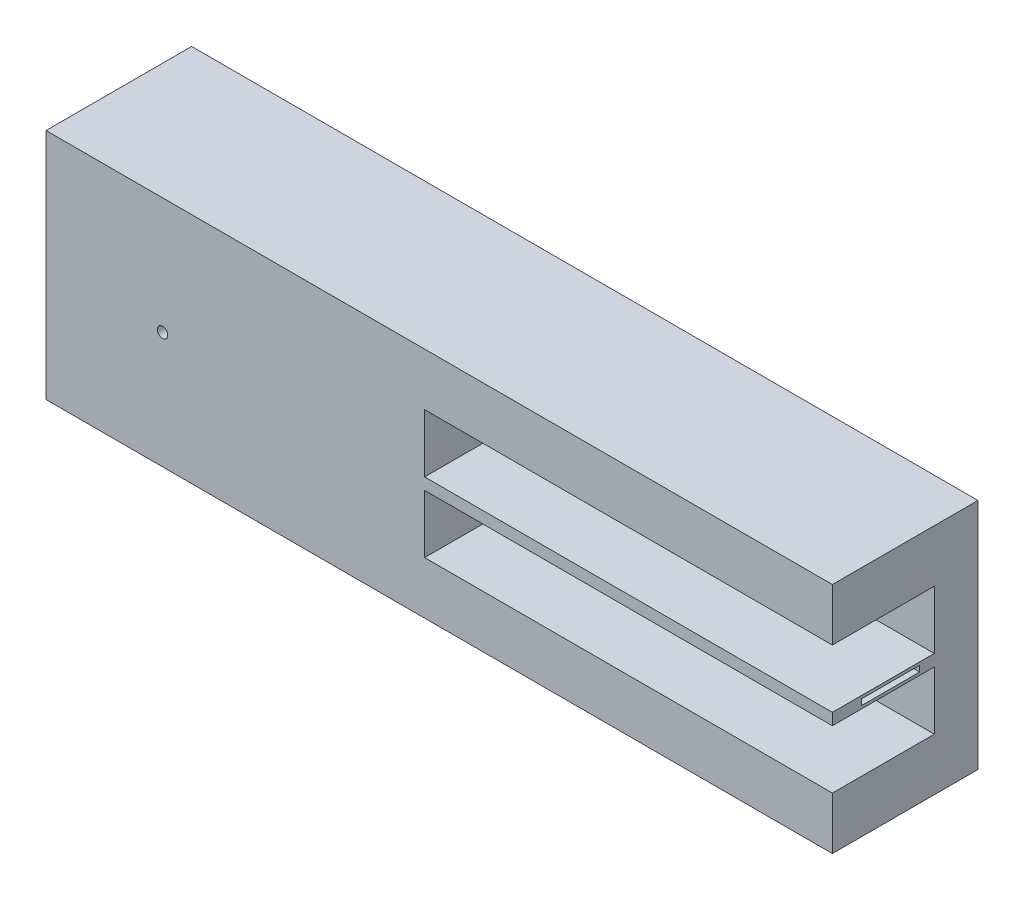
ISO-10303-21;
HEADER;
FILE_DESCRIPTION(('STEP AP214'),'2;1');
FILE_NAME('part.step','',(''),(''),'','','');
FILE_SCHEMA(('AUTOMOTIVE_DESIGN { 1 0 10303 214 1 1 1 1 }'));
ENDSEC;
DATA;
#1=APPLICATION_CONTEXT('core data for automotive mechanical design processes');
#2=APPLICATION_PROTOCOL_DEFINITION('international standard','automotive_design',2000,#1);
#3=PRODUCT_CONTEXT('',#1,'mechanical');
#4=PRODUCT('Part','Part','',(#3));
#5=PRODUCT_RELATED_PRODUCT_CATEGORY('part','',(#4));
#6=PRODUCT_DEFINITION_FORMATION('','',#4);
#7=PRODUCT_DEFINITION_CONTEXT('part definition',#1,'design');
#8=PRODUCT_DEFINITION('design','',#6,#7);
#9=PRODUCT_DEFINITION_SHAPE('','',#8);
#10=(LENGTH_UNIT() NAMED_UNIT(*) SI_UNIT(.MILLI.,.METRE.));
#11=(NAMED_UNIT(*) PLANE_ANGLE_UNIT() SI_UNIT($,.RADIAN.));
#12=(NAMED_UNIT(*) SI_UNIT($,.STERADIAN.) SOLID_ANGLE_UNIT());
#13=UNCERTAINTY_MEASURE_WITH_UNIT(LENGTH_MEASURE(1.E-05),#10,'distance_accuracy_value','');
#14=(GEOMETRIC_REPRESENTATION_CONTEXT(3) GLOBAL_UNCERTAINTY_ASSIGNED_CONTEXT((#13)) GLOBAL_UNIT_ASSIGNED_CONTEXT((#10,
#11,#12)) REPRESENTATION_CONTEXT('',''));
#15=CARTESIAN_POINT('',(0.,0.,0.));
#16=DIRECTION('',(0.,0.,1.));
#17=DIRECTION('',(1.,0.,0.));
#18=AXIS2_PLACEMENT_3D('',#15,#16,#17);
#19=CARTESIAN_POINT('',(15.,0.,0.));
#20=DIRECTION('',(-1.,0.,0.));
#21=DIRECTION('',(0.,0.,1.));
#22=AXIS2_PLACEMENT_3D('',#19,#20,#21);
#23=PLANE('',#22);
#24=DIRECTION('',(0.,1.,0.));
#25=VECTOR('',#24,1.);
#26=CARTESIAN_POINT('',(15.,-4.,2.));
#27=LINE('',#26,#25);
#28=CARTESIAN_POINT('',(15.,-0.2,2.));
#29=VERTEX_POINT('',#28);
#30=CARTESIAN_POINT('',(15.,0.2,2.));
#31=VERTEX_POINT('',#30);
#32=EDGE_CURVE('E205',#29,#31,#27,.T.);
#33=ORIENTED_EDGE('',*,*,#32,.F.);
#34=DIRECTION('',(0.,0.,1.));
#35=VECTOR('',#34,1.);
#36=CARTESIAN_POINT('',(15.,-0.2,-16.142135623731));
#37=LINE('',#36,#35);
#38=CARTESIAN_POINT('',(15.,-0.2,-1.5));
#39=VERTEX_POINT('',#38);
#40=EDGE_CURVE('E198',#39,#29,#37,.T.);
#41=ORIENTED_EDGE('',*,*,#40,.F.);
#42=DIRECTION('',(0.,-1.,0.));
#43=VECTOR('',#42,1.);
#44=CARTESIAN_POINT('',(15.,-0.2,-1.5));
#45=LINE('',#44,#43);
#46=CARTESIAN_POINT('',(15.,-2.2,-1.5));
#47=VERTEX_POINT('',#46);
#48=EDGE_CURVE('E197',#39,#47,#45,.T.);
#49=ORIENTED_EDGE('',*,*,#48,.T.);
#50=DIRECTION('',(0.,0.,1.));
#51=VECTOR('',#50,1.);
#52=CARTESIAN_POINT('',(15.,-2.2,-16.142135623731));
#53=LINE('',#52,#51);
#54=CARTESIAN_POINT('',(15.,-2.2,2.));
#55=VERTEX_POINT('',#54);
#56=EDGE_CURVE('E180',#47,#55,#53,.T.);
#57=ORIENTED_EDGE('',*,*,#56,.T.);
#58=CARTESIAN_POINT('',(15.,-4.,2.));
#59=VERTEX_POINT('',#58);
#60=EDGE_CURVE('E193',#59,#55,#27,.T.);
#61=ORIENTED_EDGE('',*,*,#60,.F.);
#62=DIRECTION('',(0.,0.,1.));
#63=VECTOR('',#62,1.);
#64=CARTESIAN_POINT('',(15.,-4.,-3.));
#65=LINE('',#64,#63);
#66=CARTESIAN_POINT('',(15.,-4.,-3.));
#67=VERTEX_POINT('',#66);
#68=EDGE_CURVE('E213',#67,#59,#65,.T.);
#69=ORIENTED_EDGE('',*,*,#68,.F.);
#70=DIRECTION('',(0.,-1.,0.));
#71=VECTOR('',#70,1.);
#72=CARTESIAN_POINT('',(15.,-4.,-3.));
#73=LINE('',#72,#71);
#74=CARTESIAN_POINT('',(15.,4.,-3.));
#75=VERTEX_POINT('',#74);
#76=EDGE_CURVE('E209',#75,#67,#73,.T.);
#77=ORIENTED_EDGE('',*,*,#76,.F.);
#78=DIRECTION('',(0.,0.,-1.));
#79=VECTOR('',#78,1.);
#80=CARTESIAN_POINT('',(15.,4.,-3.));
#81=LINE('',#80,#79);
#82=CARTESIAN_POINT('',(15.,4.,2.));
#83=VERTEX_POINT('',#82);
#84=EDGE_CURVE('E204',#83,#75,#81,.T.);
#85=ORIENTED_EDGE('',*,*,#84,.F.);
#86=CARTESIAN_POINT('',(15.,2.2,2.));
#87=VERTEX_POINT('',#86);
#88=EDGE_CURVE('E207',#87,#83,#27,.T.);
#89=ORIENTED_EDGE('',*,*,#88,.F.);
#90=DIRECTION('',(0.,0.,1.));
#91=VECTOR('',#90,1.);
#92=CARTESIAN_POINT('',(15.,2.2,-16.142135623731));
#93=LINE('',#92,#91);
#94=CARTESIAN_POINT('',(15.,2.2,-1.5));
#95=VERTEX_POINT('',#94);
#96=EDGE_CURVE('E657',#95,#87,#93,.T.);
#97=ORIENTED_EDGE('',*,*,#96,.F.);
#98=DIRECTION('',(0.,-1.,0.));
#99=VECTOR('',#98,1.);
#100=CARTESIAN_POINT('',(15.,2.2,-1.5));
#101=LINE('',#100,#99);
#102=CARTESIAN_POINT('',(15.,0.2,-1.5));
#103=VERTEX_POINT('',#102);
#104=EDGE_CURVE('E640',#95,#103,#101,.T.);
#105=ORIENTED_EDGE('',*,*,#104,.T.);
#106=DIRECTION('',(0.,0.,1.));
#107=VECTOR('',#106,1.);
#108=CARTESIAN_POINT('',(15.,0.2,-16.142135623731));
#109=LINE('',#108,#107);
#110=EDGE_CURVE('E659',#103,#31,#109,.T.);
#111=ORIENTED_EDGE('',*,*,#110,.T.);
#112=EDGE_LOOP('',(#33,#41,#49,#57,#61,#69,#77,#85,#89,#97,#105,#111));
#113=FACE_BOUND('',#112,.T.);
#114=DIRECTION('',(0.,0.,1.));
#115=VECTOR('',#114,1.);
#116=CARTESIAN_POINT('',(15.,0.1,-1.));
#117=LINE('',#116,#115);
#118=CARTESIAN_POINT('',(15.,0.1,-1.));
#119=VERTEX_POINT('',#118);
#120=CARTESIAN_POINT('',(15.,0.1,1.));
#121=VERTEX_POINT('',#120);
#122=EDGE_CURVE('E559',#119,#121,#117,.T.);
#123=ORIENTED_EDGE('',*,*,#122,.F.);
#124=DIRECTION('',(0.,1.,0.));
#125=VECTOR('',#124,1.);
#126=CARTESIAN_POINT('',(15.,-0.1,-1.));
#127=LINE('',#126,#125);
#128=CARTESIAN_POINT('',(15.,-0.1,-1.));
#129=VERTEX_POINT('',#128);
#130=EDGE_CURVE('E608',#129,#119,#127,.T.);
#131=ORIENTED_EDGE('',*,*,#130,.F.);
#132=DIRECTION('',(0.,0.,-1.));
#133=VECTOR('',#132,1.);
#134=CARTESIAN_POINT('',(15.,-0.1,-1.));
#135=LINE('',#134,#133);
#136=CARTESIAN_POINT('',(15.,-0.1,1.));
#137=VERTEX_POINT('',#136);
#138=EDGE_CURVE('E610',#137,#129,#135,.T.);
#139=ORIENTED_EDGE('',*,*,#138,.F.);
#140=DIRECTION('',(0.,-1.,0.));
#141=VECTOR('',#140,1.);
#142=CARTESIAN_POINT('',(15.,-0.1,1.));
#143=LINE('',#142,#141);
#144=EDGE_CURVE('E561',#121,#137,#143,.T.);
#145=ORIENTED_EDGE('',*,*,#144,.F.);
#146=EDGE_LOOP('',(#123,#131,#139,#145));
#147=FACE_BOUND('',#146,.T.);
#148=ADVANCED_FACE('F53',(#113,#147),#23,.F.);
#149=CARTESIAN_POINT('',(-12.,-4.,-3.));
#150=DIRECTION('',(0.,0.,-1.));
#151=DIRECTION('',(-1.,0.,0.));
#152=AXIS2_PLACEMENT_3D('',#149,#150,#151);
#153=PLANE('',#152);
#154=DIRECTION('',(1.,0.,0.));
#155=VECTOR('',#154,1.);
#156=CARTESIAN_POINT('',(-12.,4.,-3.));
#157=LINE('',#156,#155);
#158=CARTESIAN_POINT('',(-12.,4.,-3.));
#159=VERTEX_POINT('',#158);
#160=EDGE_CURVE('E57',#159,#75,#157,.T.);
#161=ORIENTED_EDGE('',*,*,#160,.T.);
#162=ORIENTED_EDGE('',*,*,#76,.T.);
#163=DIRECTION('',(1.,0.,0.));
#164=VECTOR('',#163,1.);
#165=CARTESIAN_POINT('',(-12.,-4.,-3.));
#166=LINE('',#165,#164);
#167=CARTESIAN_POINT('',(-12.,-4.,-3.));
#168=VERTEX_POINT('',#167);
#169=EDGE_CURVE('E13',#168,#67,#166,.T.);
#170=ORIENTED_EDGE('',*,*,#169,.F.);
#171=DIRECTION('',(0.,1.,0.));
#172=VECTOR('',#171,1.);
#173=CARTESIAN_POINT('',(-12.,-4.,-3.));
#174=LINE('',#173,#172);
#175=EDGE_CURVE('E225',#168,#159,#174,.T.);
#176=ORIENTED_EDGE('',*,*,#175,.T.);
#177=EDGE_LOOP('',(#161,#162,#170,#176));
#178=FACE_BOUND('',#177,.T.);
#179=ADVANCED_FACE('F55',(#178),#153,.T.);
#180=CARTESIAN_POINT('',(-12.,-4.,-3.));
#181=DIRECTION('',(0.,-1.,0.));
#182=DIRECTION('',(0.,0.,-1.));
#183=AXIS2_PLACEMENT_3D('',#180,#181,#182);
#184=PLANE('',#183);
#185=ORIENTED_EDGE('',*,*,#169,.T.);
#186=ORIENTED_EDGE('',*,*,#68,.T.);
#187=DIRECTION('',(1.,0.,0.));
#188=VECTOR('',#187,1.);
#189=CARTESIAN_POINT('',(-12.,-4.,2.));
#190=LINE('',#189,#188);
#191=CARTESIAN_POINT('',(-12.,-4.,2.));
#192=VERTEX_POINT('',#191);
#193=EDGE_CURVE('E62',#192,#59,#190,.T.);
#194=ORIENTED_EDGE('',*,*,#193,.F.);
#195=DIRECTION('',(0.,0.,-1.));
#196=VECTOR('',#195,1.);
#197=CARTESIAN_POINT('',(-12.,-4.,-3.));
#198=LINE('',#197,#196);
#199=EDGE_CURVE('E233',#192,#168,#198,.T.);
#200=ORIENTED_EDGE('',*,*,#199,.T.);
#201=EDGE_LOOP('',(#185,#186,#194,#200));
#202=FACE_BOUND('',#201,.T.);
#203=ADVANCED_FACE('F255',(#202),#184,.T.);
#204=CARTESIAN_POINT('',(-12.,-4.,2.));
#205=DIRECTION('',(0.,0.,1.));
#206=DIRECTION('',(1.,0.,0.));
#207=AXIS2_PLACEMENT_3D('',#204,#205,#206);
#208=PLANE('',#207);
#209=DIRECTION('',(-1.,0.,0.));
#210=VECTOR('',#209,1.);
#211=CARTESIAN_POINT('',(1.,-0.2,2.));
#212=LINE('',#211,#210);
#213=CARTESIAN_POINT('',(1.,-0.2,2.));
#214=VERTEX_POINT('',#213);
#215=EDGE_CURVE('E185',#29,#214,#212,.T.);
#216=ORIENTED_EDGE('',*,*,#215,.F.);
#217=ORIENTED_EDGE('',*,*,#32,.T.);
#218=DIRECTION('',(1.,0.,0.));
#219=VECTOR('',#218,1.);
#220=CARTESIAN_POINT('',(1.,0.2,2.));
#221=LINE('',#220,#219);
#222=CARTESIAN_POINT('',(0.999999999999999,0.199999999999999,2.));
#223=VERTEX_POINT('',#222);
#224=EDGE_CURVE('E650',#223,#31,#221,.T.);
#225=ORIENTED_EDGE('',*,*,#224,.F.);
#226=DIRECTION('',(0.,-1.,0.));
#227=VECTOR('',#226,1.);
#228=CARTESIAN_POINT('',(1.,2.2,2.));
#229=LINE('',#228,#227);
#230=CARTESIAN_POINT('',(1.,2.2,2.));
#231=VERTEX_POINT('',#230);
#232=EDGE_CURVE('E78',#231,#223,#229,.T.);
#233=ORIENTED_EDGE('',*,*,#232,.F.);
#234=DIRECTION('',(-1.,0.,0.));
#235=VECTOR('',#234,1.);
#236=CARTESIAN_POINT('',(1.,2.2,2.));
#237=LINE('',#236,#235);
#238=EDGE_CURVE('E652',#87,#231,#237,.T.);
#239=ORIENTED_EDGE('',*,*,#238,.F.);
#240=ORIENTED_EDGE('',*,*,#88,.T.);
#241=DIRECTION('',(1.,0.,0.));
#242=VECTOR('',#241,1.);
#243=CARTESIAN_POINT('',(-12.,4.,2.));
#244=LINE('',#243,#242);
#245=CARTESIAN_POINT('',(-12.,4.,2.));
#246=VERTEX_POINT('',#245);
#247=EDGE_CURVE('E236',#246,#83,#244,.T.);
#248=ORIENTED_EDGE('',*,*,#247,.F.);
#249=DIRECTION('',(0.,-1.,0.));
#250=VECTOR('',#249,1.);
#251=CARTESIAN_POINT('',(-12.,-4.,2.));
#252=LINE('',#251,#250);
#253=EDGE_CURVE('E231',#246,#192,#252,.T.);
#254=ORIENTED_EDGE('',*,*,#253,.T.);
#255=ORIENTED_EDGE('',*,*,#193,.T.);
#256=ORIENTED_EDGE('',*,*,#60,.T.);
#257=DIRECTION('',(1.,0.,0.));
#258=VECTOR('',#257,1.);
#259=CARTESIAN_POINT('',(1.,-2.2,2.));
#260=LINE('',#259,#258);
#261=CARTESIAN_POINT('',(0.999999999999999,-2.2,2.));
#262=VERTEX_POINT('',#261);
#263=EDGE_CURVE('E177',#262,#55,#260,.T.);
#264=ORIENTED_EDGE('',*,*,#263,.F.);
#265=DIRECTION('',(0.,-1.,0.));
#266=VECTOR('',#265,1.);
#267=CARTESIAN_POINT('',(1.,-0.2,2.));
#268=LINE('',#267,#266);
#269=EDGE_CURVE('E70',#214,#262,#268,.T.);
#270=ORIENTED_EDGE('',*,*,#269,.F.);
#271=EDGE_LOOP('',(#216,#217,#225,#233,#239,#240,#248,#254,#255,#256,#264,#270));
#272=FACE_BOUND('',#271,.T.);
#273=CARTESIAN_POINT('',(-8.,0.,2.));
#274=DIRECTION('',(0.,0.,-1.));
#275=DIRECTION('',(-1.,0.,0.));
#276=AXIS2_PLACEMENT_3D('',#273,#274,#275);
#277=CIRCLE('',#276,0.18);
#278=CARTESIAN_POINT('',(-8.18,0.,2.));
#279=VERTEX_POINT('',#278);
#280=EDGE_CURVE('E556',#279,#279,#277,.T.);
#281=ORIENTED_EDGE('',*,*,#280,.T.);
#282=EDGE_LOOP('',(#281));
#283=FACE_BOUND('',#282,.T.);
#284=ADVANCED_FACE('F201',(#272,#283),#208,.T.);
#285=CARTESIAN_POINT('',(-12.,4.,-3.));
#286=DIRECTION('',(0.,1.,0.));
#287=DIRECTION('',(0.,0.,1.));
#288=AXIS2_PLACEMENT_3D('',#285,#286,#287);
#289=PLANE('',#288);
#290=ORIENTED_EDGE('',*,*,#247,.T.);
#291=ORIENTED_EDGE('',*,*,#84,.T.);
#292=ORIENTED_EDGE('',*,*,#160,.F.);
#293=DIRECTION('',(0.,0.,1.));
#294=VECTOR('',#293,1.);
#295=CARTESIAN_POINT('',(-12.,4.,-3.));
#296=LINE('',#295,#294);
#297=EDGE_CURVE('E228',#159,#246,#296,.T.);
#298=ORIENTED_EDGE('',*,*,#297,.T.);
#299=EDGE_LOOP('',(#290,#291,#292,#298));
#300=FACE_BOUND('',#299,.T.);
#301=ADVANCED_FACE('F244',(#300),#289,.T.);
#302=CARTESIAN_POINT('',(-12.,0.,0.));
#303=DIRECTION('',(1.,0.,0.));
#304=DIRECTION('',(0.,0.,-1.));
#305=AXIS2_PLACEMENT_3D('',#302,#303,#304);
#306=PLANE('',#305);
#307=ORIENTED_EDGE('',*,*,#175,.F.);
#308=ORIENTED_EDGE('',*,*,#199,.F.);
#309=ORIENTED_EDGE('',*,*,#253,.F.);
#310=ORIENTED_EDGE('',*,*,#297,.F.);
#311=EDGE_LOOP('',(#307,#308,#309,#310));
#312=FACE_BOUND('',#311,.T.);
#313=ADVANCED_FACE('F246',(#312),#306,.F.);
#314=CARTESIAN_POINT('',(15.,0.1,-1.));
#315=DIRECTION('',(0.,-1.,0.));
#316=DIRECTION('',(0.,0.,-1.));
#317=AXIS2_PLACEMENT_3D('',#314,#315,#316);
#318=PLANE('',#317);
#319=DIRECTION('',(-1.,0.,0.));
#320=VECTOR('',#319,1.);
#321=CARTESIAN_POINT('',(15.,0.1,1.));
#322=LINE('',#321,#320);
#323=CARTESIAN_POINT('',(0.,0.1,1.));
#324=VERTEX_POINT('',#323);
#325=EDGE_CURVE('E601',#121,#324,#322,.T.);
#326=ORIENTED_EDGE('',*,*,#325,.T.);
#327=DIRECTION('',(0.,0.,1.));
#328=VECTOR('',#327,1.);
#329=CARTESIAN_POINT('',(0.,0.1,-1.));
#330=LINE('',#329,#328);
#331=CARTESIAN_POINT('',(0.,0.1,-1.));
#332=VERTEX_POINT('',#331);
#333=EDGE_CURVE('E599',#332,#324,#330,.T.);
#334=ORIENTED_EDGE('',*,*,#333,.F.);
#335=DIRECTION('',(-1.,0.,0.));
#336=VECTOR('',#335,1.);
#337=CARTESIAN_POINT('',(15.,0.1,-1.));
#338=LINE('',#337,#336);
#339=EDGE_CURVE('E602',#119,#332,#338,.T.);
#340=ORIENTED_EDGE('',*,*,#339,.F.);
#341=ORIENTED_EDGE('',*,*,#122,.T.);
#342=EDGE_LOOP('',(#326,#334,#340,#341));
#343=FACE_BOUND('',#342,.T.);
#344=ADVANCED_FACE('F250',(#343),#318,.T.);
#345=CARTESIAN_POINT('',(15.,-0.1,1.));
#346=DIRECTION('',(0.,0.,-1.));
#347=DIRECTION('',(-1.,0.,0.));
#348=AXIS2_PLACEMENT_3D('',#345,#346,#347);
#349=PLANE('',#348);
#350=DIRECTION('',(-1.,0.,0.));
#351=VECTOR('',#350,1.);
#352=CARTESIAN_POINT('',(15.,-0.1,1.));
#353=LINE('',#352,#351);
#354=CARTESIAN_POINT('',(0.,-0.1,1.));
#355=VERTEX_POINT('',#354);
#356=EDGE_CURVE('E612',#137,#355,#353,.T.);
#357=ORIENTED_EDGE('',*,*,#356,.T.);
#358=DIRECTION('',(0.,-1.,0.));
#359=VECTOR('',#358,1.);
#360=CARTESIAN_POINT('',(0.,-0.1,1.));
#361=LINE('',#360,#359);
#362=EDGE_CURVE('E605',#324,#355,#361,.T.);
#363=ORIENTED_EDGE('',*,*,#362,.F.);
#364=ORIENTED_EDGE('',*,*,#325,.F.);
#365=ORIENTED_EDGE('',*,*,#144,.T.);
#366=EDGE_LOOP('',(#357,#363,#364,#365));
#367=FACE_BOUND('',#366,.T.);
#368=ADVANCED_FACE('F287',(#367),#349,.T.);
#369=CARTESIAN_POINT('',(15.,-0.1,-1.));
#370=DIRECTION('',(0.,1.,0.));
#371=DIRECTION('',(0.,0.,1.));
#372=AXIS2_PLACEMENT_3D('',#369,#370,#371);
#373=PLANE('',#372);
#374=DIRECTION('',(-1.,0.,0.));
#375=VECTOR('',#374,1.);
#376=CARTESIAN_POINT('',(15.,-0.1,-1.));
#377=LINE('',#376,#375);
#378=CARTESIAN_POINT('',(0.,-0.1,-1.));
#379=VERTEX_POINT('',#378);
#380=EDGE_CURVE('E221',#129,#379,#377,.T.);
#381=ORIENTED_EDGE('',*,*,#380,.T.);
#382=DIRECTION('',(0.,0.,-1.));
#383=VECTOR('',#382,1.);
#384=CARTESIAN_POINT('',(0.,-0.1,-1.));
#385=LINE('',#384,#383);
#386=EDGE_CURVE('E615',#355,#379,#385,.T.);
#387=ORIENTED_EDGE('',*,*,#386,.F.);
#388=ORIENTED_EDGE('',*,*,#356,.F.);
#389=ORIENTED_EDGE('',*,*,#138,.T.);
#390=EDGE_LOOP('',(#381,#387,#388,#389));
#391=FACE_BOUND('',#390,.T.);
#392=ADVANCED_FACE('F298',(#391),#373,.T.);
#393=CARTESIAN_POINT('',(15.,-0.1,-1.));
#394=DIRECTION('',(0.,0.,1.));
#395=DIRECTION('',(1.,0.,0.));
#396=AXIS2_PLACEMENT_3D('',#393,#394,#395);
#397=PLANE('',#396);
#398=DIRECTION('',(0.,1.,0.));
#399=VECTOR('',#398,1.);
#400=CARTESIAN_POINT('',(0.,-0.1,-1.));
#401=LINE('',#400,#399);
#402=EDGE_CURVE('E217',#379,#332,#401,.T.);
#403=ORIENTED_EDGE('',*,*,#402,.F.);
#404=ORIENTED_EDGE('',*,*,#380,.F.);
#405=ORIENTED_EDGE('',*,*,#130,.T.);
#406=ORIENTED_EDGE('',*,*,#339,.T.);
#407=EDGE_LOOP('',(#403,#404,#405,#406));
#408=FACE_BOUND('',#407,.T.);
#409=ADVANCED_FACE('F253',(#408),#397,.T.);
#410=CARTESIAN_POINT('',(-4.,0.0179106694237798,-0.179106694237798));
#411=CARTESIAN_POINT('',(0.,0.1,-1.));
#412=CARTESIAN_POINT('',(-4.,0.0476136397208095,-0.176136397208095));
#413=CARTESIAN_POINT('',(0.,0.1,-0.833333333333333));
#414=CARTESIAN_POINT('',(-4.,0.0849605204796646,-0.164963936650788));
#415=CARTESIAN_POINT('',(0.,0.1,-0.666666666666667));
#416=CARTESIAN_POINT('',(-4.,0.152673534996351,-0.105461756799413));
#417=CARTESIAN_POINT('',(0.,0.1,-0.333333333333333));
#418=CARTESIAN_POINT('',(-4.,0.18,-0.0542992537267254));
#419=CARTESIAN_POINT('',(0.,0.1,-0.166666666666666));
#420=CARTESIAN_POINT('',(-4.,0.18,0.0542992537267253));
#421=CARTESIAN_POINT('',(0.,0.1,0.166666666666667));
#422=CARTESIAN_POINT('',(-4.,0.152673534996351,0.105461756799413));
#423=CARTESIAN_POINT('',(0.,0.1,0.333333333333333));
#424=CARTESIAN_POINT('',(-4.,0.0849605204796646,0.164963936650788));
#425=CARTESIAN_POINT('',(0.,0.1,0.666666666666667));
#426=CARTESIAN_POINT('',(-4.,0.0476136397208095,0.176136397208095));
#427=CARTESIAN_POINT('',(0.,0.1,0.833333333333333));
#428=CARTESIAN_POINT('',(-4.,0.0179106694237798,0.179106694237798));
#429=CARTESIAN_POINT('',(0.,0.1,1.));
#430=B_SPLINE_SURFACE_WITH_KNOTS('',3,1,((#410,#411),(#412,#413),(#414,#415),(#416,#417),(#418,
#419),(#420,#421),(#422,#423),(#424,#425),(#426,#427),(#428,#429)),.UNSPECIFIED.,.F.,.F.,.F.,(4,
2,2,2,4),(2,2),(0.,0.25,0.5,0.75,1.),(0.,1.),.UNSPECIFIED.);
#431=CARTESIAN_POINT('',(-4.,0.,0.));
#432=DIRECTION('',(1.,0.,0.));
#433=DIRECTION('',(0.,0.,-1.));
#434=AXIS2_PLACEMENT_3D('',#431,#432,#433);
#435=CIRCLE('',#434,0.18);
#436=CARTESIAN_POINT('',(-4.,-2.25182983984406E-06,-0.179584769039963));
#437=VERTEX_POINT('',#436);
#438=CARTESIAN_POINT('',(-4.,0.0179128143492389,0.179132556837052));
#439=VERTEX_POINT('',#438);
#440=EDGE_CURVE('E510',#437,#439,#435,.T.);
#441=DIRECTION('',(0.979386467590009,0.0200992948749682,-0.200992948749682));
#442=VECTOR('',#441,1.);
#443=CARTESIAN_POINT('',(-2.,0.0589553347118899,-0.589553347118899));
#444=LINE('',#443,#442);
#445=EDGE_CURVE('E515',#437,#332,#444,.T.);
#446=DIRECTION('',(0.97938646759001,0.0200992948749682,0.200992948749682));
#447=VECTOR('',#446,1.);
#448=CARTESIAN_POINT('',(-2.,0.0589553347118899,0.589553347118899));
#449=LINE('',#448,#447);
#450=EDGE_CURVE('E560',#439,#324,#449,.T.);
#451=ORIENTED_EDGE('',*,*,#440,.F.);
#452=ORIENTED_EDGE('',*,*,#445,.T.);
#453=ORIENTED_EDGE('',*,*,#333,.T.);
#454=ORIENTED_EDGE('',*,*,#450,.F.);
#455=EDGE_LOOP('',(#451,#452,#453,#454));
#456=FACE_BOUND('',#455,.T.);
#457=ADVANCED_FACE('F316',(#456),#430,.F.);
#458=CARTESIAN_POINT('',(-4.,0.0179106694237798,0.179106694237798));
#459=CARTESIAN_POINT('',(0.,0.1,1.));
#460=CARTESIAN_POINT('',(-4.,0.0119700753643739,0.179700753643739));
#461=CARTESIAN_POINT('',(0.,0.0666666666666667,1.));
#462=CARTESIAN_POINT('',(-4.,0.00598503768218694,0.179997783346709));
#463=CARTESIAN_POINT('',(0.,0.0333333333333333,1.));
#464=CARTESIAN_POINT('',(-4.,-0.0059850376821869,0.179997783346709));
#465=CARTESIAN_POINT('',(0.,-0.0333333333333333,1.));
#466=CARTESIAN_POINT('',(-4.,-0.0119700753643738,0.179700753643739));
#467=CARTESIAN_POINT('',(0.,-0.0666666666666667,1.));
#468=CARTESIAN_POINT('',(-4.,-0.0179106694237798,0.179106694237798));
#469=CARTESIAN_POINT('',(0.,-0.1,1.));
#470=B_SPLINE_SURFACE_WITH_KNOTS('',3,1,((#458,#459),(#460,#461),(#462,#463),(#464,#465),(#466,
#467),(#468,#469)),.UNSPECIFIED.,.F.,.F.,.F.,(4,2,4),(2,2),(0.,0.5,1.),(0.,1.),.UNSPECIFIED.);
#471=CARTESIAN_POINT('',(-4.,0.0179106694237798,0.179106694237798));
#472=CARTESIAN_POINT('',(-4.,0.0119700753643739,0.179700753643739));
#473=CARTESIAN_POINT('',(-4.,0.00598503768218694,0.179997783346709));
#474=CARTESIAN_POINT('',(-4.,-0.0059850376821869,0.179997783346709));
#475=CARTESIAN_POINT('',(-4.,-0.0119700753643738,0.179700753643739));
#476=CARTESIAN_POINT('',(-4.,-0.0179106694237798,0.179106694237798));
#477=B_SPLINE_CURVE_WITH_KNOTS('',3,(#471,#472,#473,#474,#475,#476),.UNSPECIFIED.,.F.,.F.,(4,2,
4),(0.,0.5,1.),.UNSPECIFIED.);
#478=CARTESIAN_POINT('',(-4.,-0.0179165995979563,0.179184482098142));
#479=VERTEX_POINT('',#478);
#480=EDGE_CURVE('E552',#439,#479,#477,.T.);
#481=DIRECTION('',(-0.97938646759001,0.0200992948749682,-0.200992948749682));
#482=VECTOR('',#481,1.);
#483=CARTESIAN_POINT('',(-2.,-0.0589553347118899,0.589553347118899));
#484=LINE('',#483,#482);
#485=EDGE_CURVE('E573',#355,#479,#484,.T.);
#486=ORIENTED_EDGE('',*,*,#480,.F.);
#487=ORIENTED_EDGE('',*,*,#450,.T.);
#488=ORIENTED_EDGE('',*,*,#362,.T.);
#489=ORIENTED_EDGE('',*,*,#485,.T.);
#490=EDGE_LOOP('',(#486,#487,#488,#489));
#491=FACE_BOUND('',#490,.T.);
#492=ADVANCED_FACE('F325',(#491),#470,.F.);
#493=CARTESIAN_POINT('',(-4.,-0.0179106694237798,-0.179106694237798));
#494=CARTESIAN_POINT('',(0.,-0.1,-1.));
#495=CARTESIAN_POINT('',(-4.,-0.0119700753643739,-0.179700753643739));
#496=CARTESIAN_POINT('',(0.,-0.0666666666666667,-1.));
#497=CARTESIAN_POINT('',(-4.,-0.00598503768218695,-0.179997783346709));
#498=CARTESIAN_POINT('',(0.,-0.0333333333333333,-1.));
#499=CARTESIAN_POINT('',(-4.,0.00598503768218691,-0.179997783346709));
#500=CARTESIAN_POINT('',(0.,0.0333333333333333,-1.));
#501=CARTESIAN_POINT('',(-4.,0.0119700753643738,-0.179700753643739));
#502=CARTESIAN_POINT('',(0.,0.0666666666666667,-1.));
#503=CARTESIAN_POINT('',(-4.,0.0179106694237798,-0.179106694237798));
#504=CARTESIAN_POINT('',(0.,0.1,-1.));
#505=B_SPLINE_SURFACE_WITH_KNOTS('',3,1,((#493,#494),(#495,#496),(#497,#498),(#499,#500),(#501,
#502),(#503,#504)),.UNSPECIFIED.,.F.,.F.,.F.,(4,2,4),(2,2),(0.,0.5,1.),(0.,1.),.UNSPECIFIED.);
#506=DIRECTION('',(0.979386467590009,-0.0200992948749682,-0.200992948749682));
#507=VECTOR('',#506,1.);
#508=CARTESIAN_POINT('',(-2.,-0.0589553347118899,-0.589553347118899));
#509=LINE('',#508,#507);
#510=EDGE_CURVE('E551',#437,#379,#509,.T.);
#511=ORIENTED_EDGE('',*,*,#510,.T.);
#512=ORIENTED_EDGE('',*,*,#402,.T.);
#513=ORIENTED_EDGE('',*,*,#445,.F.);
#514=EDGE_LOOP('',(#511,#512,#513));
#515=FACE_BOUND('',#514,.T.);
#516=ADVANCED_FACE('F336',(#515),#505,.F.);
#517=CARTESIAN_POINT('',(-4.,-0.0179106694237798,0.179106694237798));
#518=CARTESIAN_POINT('',(0.,-0.1,1.));
#519=CARTESIAN_POINT('',(-4.,-0.0476136397208094,0.176136397208095));
#520=CARTESIAN_POINT('',(0.,-0.1,0.833333333333333));
#521=CARTESIAN_POINT('',(-4.,-0.0849605204796645,0.164963936650788));
#522=CARTESIAN_POINT('',(0.,-0.1,0.666666666666665));
#523=CARTESIAN_POINT('',(-4.,-0.152673534996351,0.105461756799413));
#524=CARTESIAN_POINT('',(0.,-0.1,0.333333333333332));
#525=CARTESIAN_POINT('',(-4.,-0.18,0.0542992537267254));
#526=CARTESIAN_POINT('',(0.,-0.1,0.166666666666665));
#527=CARTESIAN_POINT('',(-4.,-0.18,-0.0542992537267253));
#528=CARTESIAN_POINT('',(0.,-0.1,-0.166666666666668));
#529=CARTESIAN_POINT('',(-4.,-0.152673534996351,-0.105461756799413));
#530=CARTESIAN_POINT('',(0.,-0.1,-0.333333333333335));
#531=CARTESIAN_POINT('',(-4.,-0.0849605204796646,-0.164963936650788));
#532=CARTESIAN_POINT('',(0.,-0.1,-0.666666666666668));
#533=CARTESIAN_POINT('',(-4.,-0.0476136397208095,-0.176136397208095));
#534=CARTESIAN_POINT('',(0.,-0.1,-0.833333333333334));
#535=CARTESIAN_POINT('',(-4.,-0.0179106694237798,-0.179106694237798));
#536=CARTESIAN_POINT('',(0.,-0.1,-1.));
#537=B_SPLINE_SURFACE_WITH_KNOTS('',3,1,((#517,#518),(#519,#520),(#521,#522),(#523,#524),(#525,
#526),(#527,#528),(#529,#530),(#531,#532),(#533,#534),(#535,#536)),.UNSPECIFIED.,.F.,.F.,.F.,(4,
2,2,2,4),(2,2),(0.,0.25,0.5,0.75,1.),(0.,1.),.UNSPECIFIED.);
#538=EDGE_CURVE('E505',#479,#437,#435,.T.);
#539=ORIENTED_EDGE('',*,*,#538,.F.);
#540=ORIENTED_EDGE('',*,*,#485,.F.);
#541=ORIENTED_EDGE('',*,*,#386,.T.);
#542=ORIENTED_EDGE('',*,*,#510,.F.);
#543=EDGE_LOOP('',(#539,#540,#541,#542));
#544=FACE_BOUND('',#543,.T.);
#545=ADVANCED_FACE('F290',(#544),#537,.F.);
#546=CARTESIAN_POINT('',(-4.,0.,0.));
#547=DIRECTION('',(-1.,0.,0.));
#548=DIRECTION('',(0.,0.,1.));
#549=AXIS2_PLACEMENT_3D('',#546,#547,#548);
#550=CYLINDRICAL_SURFACE('',#549,0.18);
#551=CARTESIAN_POINT('',(-6.,0.,0.));
#552=DIRECTION('',(1.,0.,0.));
#553=DIRECTION('',(0.,0.,-1.));
#554=AXIS2_PLACEMENT_3D('',#551,#552,#553);
#555=CIRCLE('',#554,0.18);
#556=CARTESIAN_POINT('',(-6.,0.,-0.18));
#557=VERTEX_POINT('',#556);
#558=EDGE_CURVE('E631',#557,#557,#555,.T.);
#559=ORIENTED_EDGE('',*,*,#558,.F.);
#560=EDGE_LOOP('',(#559));
#561=FACE_BOUND('',#560,.T.);
#562=ORIENTED_EDGE('',*,*,#440,.T.);
#563=ORIENTED_EDGE('',*,*,#480,.T.);
#564=ORIENTED_EDGE('',*,*,#538,.T.);
#565=EDGE_LOOP('',(#562,#563,#564));
#566=FACE_BOUND('',#565,.T.);
#567=ADVANCED_FACE('F355',(#561,#566),#550,.F.);
#568=CARTESIAN_POINT('',(-6.,0.,2.));
#569=DIRECTION('',(0.,1.,0.));
#570=DIRECTION('',(0.,0.,1.));
#571=AXIS2_PLACEMENT_3D('',#568,#569,#570);
#572=TOROIDAL_SURFACE('',#571,2.,0.18);
#573=CARTESIAN_POINT('',(-6.,0.,2.));
#574=DIRECTION('',(0.,1.,0.));
#575=DIRECTION('',(0.,0.,1.));
#576=AXIS2_PLACEMENT_3D('',#573,#574,#575);
#577=CIRCLE('',#576,2.18);
#578=EDGE_CURVE('',#557,#279,#577,.T.);
#579=ORIENTED_EDGE('',*,*,#558,.T.);
#580=ORIENTED_EDGE('',*,*,#280,.F.);
#581=ORIENTED_EDGE('',*,*,#578,.T.);
#582=ORIENTED_EDGE('',*,*,#578,.F.);
#583=EDGE_LOOP('',(#579,#581,#580,#582));
#584=FACE_BOUND('',#583,.T.);
#585=ADVANCED_FACE('F328',(#584),#572,.F.);
#586=CARTESIAN_POINT('',(1.,2.2,-16.142135623731));
#587=DIRECTION('',(-1.,0.,0.));
#588=DIRECTION('',(0.,-1.,0.));
#589=AXIS2_PLACEMENT_3D('',#586,#587,#588);
#590=PLANE('',#589);
#591=DIRECTION('',(0.,1.,0.));
#592=VECTOR('',#591,1.);
#593=CARTESIAN_POINT('',(1.,2.2,-1.5));
#594=LINE('',#593,#592);
#595=CARTESIAN_POINT('',(1.,0.2,-1.5));
#596=VERTEX_POINT('',#595);
#597=CARTESIAN_POINT('',(1.,2.2,-1.5));
#598=VERTEX_POINT('',#597);
#599=EDGE_CURVE('E646',#596,#598,#594,.T.);
#600=ORIENTED_EDGE('',*,*,#599,.T.);
#601=DIRECTION('',(0.,0.,1.));
#602=VECTOR('',#601,1.);
#603=CARTESIAN_POINT('',(1.,2.2,-16.142135623731));
#604=LINE('',#603,#602);
#605=EDGE_CURVE('E643',#598,#231,#604,.T.);
#606=ORIENTED_EDGE('',*,*,#605,.T.);
#607=ORIENTED_EDGE('',*,*,#232,.T.);
#608=DIRECTION('',(0.,0.,1.));
#609=VECTOR('',#608,1.);
#610=CARTESIAN_POINT('',(1.,0.2,-16.142135623731));
#611=LINE('',#610,#609);
#612=EDGE_CURVE('E655',#596,#223,#611,.T.);
#613=ORIENTED_EDGE('',*,*,#612,.F.);
#614=EDGE_LOOP('',(#600,#606,#607,#613));
#615=FACE_BOUND('',#614,.T.);
#616=ADVANCED_FACE('F367',(#615),#590,.F.);
#617=CARTESIAN_POINT('',(1.,2.2,-16.142135623731));
#618=DIRECTION('',(0.,1.,0.));
#619=DIRECTION('',(0.,0.,1.));
#620=AXIS2_PLACEMENT_3D('',#617,#618,#619);
#621=PLANE('',#620);
#622=DIRECTION('',(1.,0.,0.));
#623=VECTOR('',#622,1.);
#624=CARTESIAN_POINT('',(1.,2.2,-1.5));
#625=LINE('',#624,#623);
#626=EDGE_CURVE('E644',#598,#95,#625,.T.);
#627=ORIENTED_EDGE('',*,*,#626,.T.);
#628=ORIENTED_EDGE('',*,*,#96,.T.);
#629=ORIENTED_EDGE('',*,*,#238,.T.);
#630=ORIENTED_EDGE('',*,*,#605,.F.);
#631=EDGE_LOOP('',(#627,#628,#629,#630));
#632=FACE_BOUND('',#631,.T.);
#633=ADVANCED_FACE('F383',(#632),#621,.F.);
#634=CARTESIAN_POINT('',(1.,0.2,-16.142135623731));
#635=DIRECTION('',(0.,-1.,0.));
#636=DIRECTION('',(1.,0.,0.));
#637=AXIS2_PLACEMENT_3D('',#634,#635,#636);
#638=PLANE('',#637);
#639=DIRECTION('',(-1.,0.,0.));
#640=VECTOR('',#639,1.);
#641=CARTESIAN_POINT('',(1.,0.2,-1.5));
#642=LINE('',#641,#640);
#643=EDGE_CURVE('E648',#103,#596,#642,.T.);
#644=ORIENTED_EDGE('',*,*,#643,.T.);
#645=ORIENTED_EDGE('',*,*,#612,.T.);
#646=ORIENTED_EDGE('',*,*,#224,.T.);
#647=ORIENTED_EDGE('',*,*,#110,.F.);
#648=EDGE_LOOP('',(#644,#645,#646,#647));
#649=FACE_BOUND('',#648,.T.);
#650=ADVANCED_FACE('F391',(#649),#638,.F.);
#651=CARTESIAN_POINT('',(15.,-0.1,-1.5));
#652=DIRECTION('',(0.,0.,1.));
#653=DIRECTION('',(1.,0.,0.));
#654=AXIS2_PLACEMENT_3D('',#651,#652,#653);
#655=PLANE('',#654);
#656=ORIENTED_EDGE('',*,*,#599,.F.);
#657=ORIENTED_EDGE('',*,*,#643,.F.);
#658=ORIENTED_EDGE('',*,*,#104,.F.);
#659=ORIENTED_EDGE('',*,*,#626,.F.);
#660=EDGE_LOOP('',(#656,#657,#658,#659));
#661=FACE_BOUND('',#660,.T.);
#662=ADVANCED_FACE('F400',(#661),#655,.T.);
#663=CARTESIAN_POINT('',(1.,-0.2,-16.142135623731));
#664=DIRECTION('',(-1.,0.,0.));
#665=DIRECTION('',(0.,0.,1.));
#666=AXIS2_PLACEMENT_3D('',#663,#664,#665);
#667=PLANE('',#666);
#668=DIRECTION('',(0.,1.,0.));
#669=VECTOR('',#668,1.);
#670=CARTESIAN_POINT('',(1.,-0.2,-1.5));
#671=LINE('',#670,#669);
#672=CARTESIAN_POINT('',(1.,-2.2,-1.5));
#673=VERTEX_POINT('',#672);
#674=CARTESIAN_POINT('',(1.,-0.2,-1.5));
#675=VERTEX_POINT('',#674);
#676=EDGE_CURVE('E637',#673,#675,#671,.T.);
#677=ORIENTED_EDGE('',*,*,#676,.T.);
#678=DIRECTION('',(0.,0.,1.));
#679=VECTOR('',#678,1.);
#680=CARTESIAN_POINT('',(1.,-0.2,-16.142135623731));
#681=LINE('',#680,#679);
#682=EDGE_CURVE('E666',#675,#214,#681,.T.);
#683=ORIENTED_EDGE('',*,*,#682,.T.);
#684=ORIENTED_EDGE('',*,*,#269,.T.);
#685=DIRECTION('',(0.,0.,1.));
#686=VECTOR('',#685,1.);
#687=CARTESIAN_POINT('',(1.,-2.2,-16.142135623731));
#688=LINE('',#687,#686);
#689=EDGE_CURVE('E182',#673,#262,#688,.T.);
#690=ORIENTED_EDGE('',*,*,#689,.F.);
#691=EDGE_LOOP('',(#677,#683,#684,#690));
#692=FACE_BOUND('',#691,.T.);
#693=ADVANCED_FACE('F409',(#692),#667,.F.);
#694=CARTESIAN_POINT('',(1.,-0.2,-16.142135623731));
#695=DIRECTION('',(0.,1.,0.));
#696=DIRECTION('',(0.,0.,1.));
#697=AXIS2_PLACEMENT_3D('',#694,#695,#696);
#698=PLANE('',#697);
#699=DIRECTION('',(1.,0.,0.));
#700=VECTOR('',#699,1.);
#701=CARTESIAN_POINT('',(1.,-0.2,-1.5));
#702=LINE('',#701,#700);
#703=EDGE_CURVE('E672',#675,#39,#702,.T.);
#704=ORIENTED_EDGE('',*,*,#703,.T.);
#705=ORIENTED_EDGE('',*,*,#40,.T.);
#706=ORIENTED_EDGE('',*,*,#215,.T.);
#707=ORIENTED_EDGE('',*,*,#682,.F.);
#708=EDGE_LOOP('',(#704,#705,#706,#707));
#709=FACE_BOUND('',#708,.T.);
#710=ADVANCED_FACE('F418',(#709),#698,.F.);
#711=CARTESIAN_POINT('',(1.,-2.2,-16.142135623731));
#712=DIRECTION('',(0.,-1.,0.));
#713=DIRECTION('',(0.,0.,-1.));
#714=AXIS2_PLACEMENT_3D('',#711,#712,#713);
#715=PLANE('',#714);
#716=DIRECTION('',(-1.,0.,0.));
#717=VECTOR('',#716,1.);
#718=CARTESIAN_POINT('',(1.,-2.2,-1.5));
#719=LINE('',#718,#717);
#720=EDGE_CURVE('E634',#47,#673,#719,.T.);
#721=ORIENTED_EDGE('',*,*,#720,.T.);
#722=ORIENTED_EDGE('',*,*,#689,.T.);
#723=ORIENTED_EDGE('',*,*,#263,.T.);
#724=ORIENTED_EDGE('',*,*,#56,.F.);
#725=EDGE_LOOP('',(#721,#722,#723,#724));
#726=FACE_BOUND('',#725,.T.);
#727=ADVANCED_FACE('F179',(#726),#715,.F.);
#728=CARTESIAN_POINT('',(15.,-0.1,-1.5));
#729=DIRECTION('',(0.,0.,1.));
#730=DIRECTION('',(1.,0.,0.));
#731=AXIS2_PLACEMENT_3D('',#728,#729,#730);
#732=PLANE('',#731);
#733=ORIENTED_EDGE('',*,*,#676,.F.);
#734=ORIENTED_EDGE('',*,*,#720,.F.);
#735=ORIENTED_EDGE('',*,*,#48,.F.);
#736=ORIENTED_EDGE('',*,*,#703,.F.);
#737=EDGE_LOOP('',(#733,#734,#735,#736));
#738=FACE_BOUND('',#737,.T.);
#739=ADVANCED_FACE('F434',(#738),#732,.T.);
#740=CLOSED_SHELL('',(#148,#179,#203,#284,#301,#313,#344,#368,#392,#409,#457,#492,#516,#545,
#567,#585,#616,#633,#650,#662,#693,#710,#727,#739));
#741=MANIFOLD_SOLID_BREP('B2',#740);
#742=ADVANCED_BREP_SHAPE_REPRESENTATION('',(#18,#741),#14);
#743=SHAPE_DEFINITION_REPRESENTATION(#9,#742);
ENDSEC;
END-ISO-10303-21;
